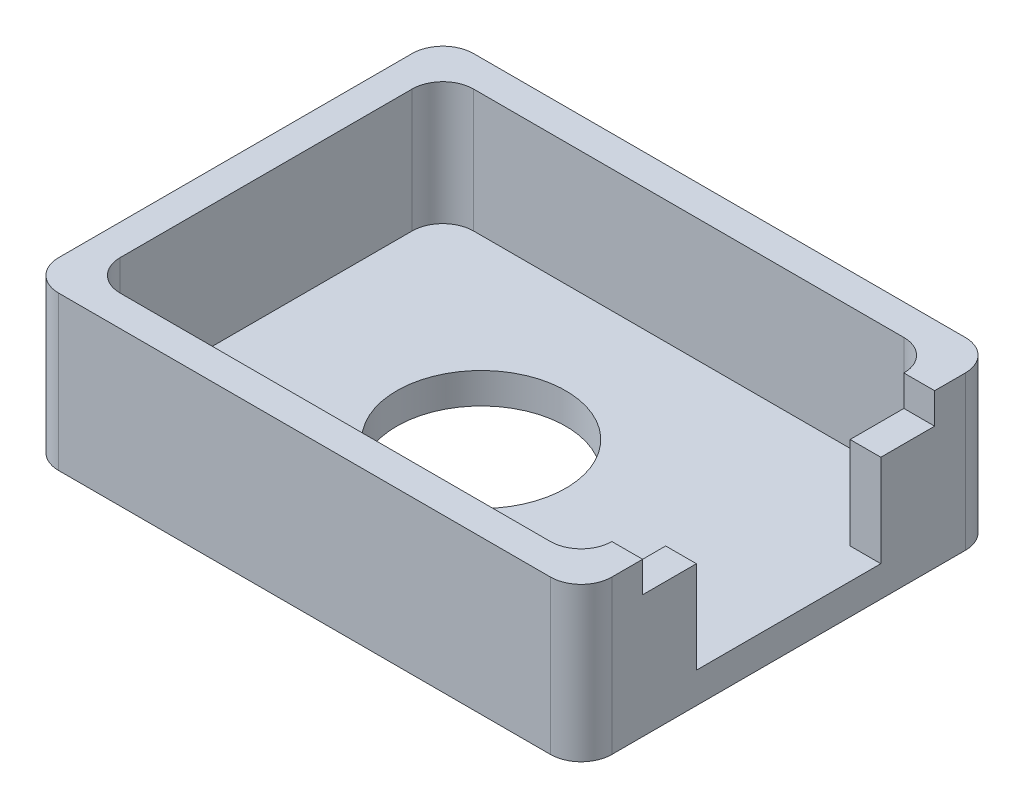
ISO-10303-21;
HEADER;
FILE_DESCRIPTION(('STEP AP214'),'2;1');
FILE_NAME('part.step','',(''),(''),'','','');
FILE_SCHEMA(('AUTOMOTIVE_DESIGN { 1 0 10303 214 1 1 1 1 }'));
ENDSEC;
DATA;
#1=APPLICATION_CONTEXT('core data for automotive mechanical design processes');
#2=APPLICATION_PROTOCOL_DEFINITION('international standard','automotive_design',2000,#1);
#3=PRODUCT_CONTEXT('',#1,'mechanical');
#4=PRODUCT('Part','Part','',(#3));
#5=PRODUCT_RELATED_PRODUCT_CATEGORY('part','',(#4));
#6=PRODUCT_DEFINITION_FORMATION('','',#4);
#7=PRODUCT_DEFINITION_CONTEXT('part definition',#1,'design');
#8=PRODUCT_DEFINITION('design','',#6,#7);
#9=PRODUCT_DEFINITION_SHAPE('','',#8);
#10=(LENGTH_UNIT() NAMED_UNIT(*) SI_UNIT(.MILLI.,.METRE.));
#11=(NAMED_UNIT(*) PLANE_ANGLE_UNIT() SI_UNIT($,.RADIAN.));
#12=(NAMED_UNIT(*) SI_UNIT($,.STERADIAN.) SOLID_ANGLE_UNIT());
#13=UNCERTAINTY_MEASURE_WITH_UNIT(LENGTH_MEASURE(1.E-05),#10,'distance_accuracy_value','');
#14=(GEOMETRIC_REPRESENTATION_CONTEXT(3) GLOBAL_UNCERTAINTY_ASSIGNED_CONTEXT((#13)) GLOBAL_UNIT_ASSIGNED_CONTEXT((#10,
#11,#12)) REPRESENTATION_CONTEXT('',''));
#15=CARTESIAN_POINT('',(0.,0.,0.));
#16=DIRECTION('',(0.,0.,1.));
#17=DIRECTION('',(1.,0.,0.));
#18=AXIS2_PLACEMENT_3D('',#15,#16,#17);
#19=CARTESIAN_POINT('',(0.,2.,0.));
#20=DIRECTION('',(0.,-1.,0.));
#21=DIRECTION('',(0.,0.,-1.));
#22=AXIS2_PLACEMENT_3D('',#19,#20,#21);
#23=PLANE('',#22);
#24=CARTESIAN_POINT('',(-2.00000000000001,2.,0.));
#25=DIRECTION('',(0.,1.,0.));
#26=DIRECTION('',(0.,0.,1.));
#27=AXIS2_PLACEMENT_3D('',#24,#25,#26);
#28=CIRCLE('',#27,5.5);
#29=CARTESIAN_POINT('',(-2.00000000000001,2.,5.5));
#30=VERTEX_POINT('',#29);
#31=EDGE_CURVE('E253',#30,#30,#28,.T.);
#32=ORIENTED_EDGE('',*,*,#31,.F.);
#33=EDGE_LOOP('',(#32));
#34=FACE_BOUND('',#33,.T.);
#35=DIRECTION('',(0.,0.,1.));
#36=VECTOR('',#35,1.);
#37=CARTESIAN_POINT('',(16.,2.,-11.5));
#38=LINE('',#37,#36);
#39=CARTESIAN_POINT('',(16.,2.,-9.49999999999999));
#40=VERTEX_POINT('',#39);
#41=CARTESIAN_POINT('',(16.0000000000001,2.,-5.99999999999999));
#42=VERTEX_POINT('',#41);
#43=EDGE_CURVE('E392',#40,#42,#38,.T.);
#44=ORIENTED_EDGE('',*,*,#43,.F.);
#45=CARTESIAN_POINT('',(14.,2.,-9.49999999999999));
#46=DIRECTION('',(0.,-1.,0.));
#47=DIRECTION('',(0.,0.,-1.));
#48=AXIS2_PLACEMENT_3D('',#45,#46,#47);
#49=CIRCLE('',#48,2.);
#50=CARTESIAN_POINT('',(14.,2.,-11.5));
#51=VERTEX_POINT('',#50);
#52=EDGE_CURVE('E267',#40,#51,#49,.F.);
#53=ORIENTED_EDGE('',*,*,#52,.T.);
#54=DIRECTION('',(1.,0.,0.));
#55=VECTOR('',#54,1.);
#56=CARTESIAN_POINT('',(-16.,2.,-11.5));
#57=LINE('',#56,#55);
#58=CARTESIAN_POINT('',(-14.,2.,-11.5));
#59=VERTEX_POINT('',#58);
#60=EDGE_CURVE('E383',#59,#51,#57,.T.);
#61=ORIENTED_EDGE('',*,*,#60,.F.);
#62=CARTESIAN_POINT('',(-14.,2.,-9.49999999999999));
#63=DIRECTION('',(0.,-1.,0.));
#64=DIRECTION('',(0.,0.,-1.));
#65=AXIS2_PLACEMENT_3D('',#62,#63,#64);
#66=CIRCLE('',#65,2.);
#67=CARTESIAN_POINT('',(-16.,2.,-9.49999999999999));
#68=VERTEX_POINT('',#67);
#69=EDGE_CURVE('E240',#59,#68,#66,.F.);
#70=ORIENTED_EDGE('',*,*,#69,.T.);
#71=DIRECTION('',(0.,0.,-1.));
#72=VECTOR('',#71,1.);
#73=CARTESIAN_POINT('',(-16.,2.,11.5));
#74=LINE('',#73,#72);
#75=CARTESIAN_POINT('',(-16.,2.,9.50000000000001));
#76=VERTEX_POINT('',#75);
#77=EDGE_CURVE('E375',#76,#68,#74,.T.);
#78=ORIENTED_EDGE('',*,*,#77,.F.);
#79=CARTESIAN_POINT('',(-14.,2.,9.50000000000001));
#80=DIRECTION('',(0.,-1.,0.));
#81=DIRECTION('',(0.,0.,-1.));
#82=AXIS2_PLACEMENT_3D('',#79,#80,#81);
#83=CIRCLE('',#82,2.);
#84=CARTESIAN_POINT('',(-14.,2.,11.5));
#85=VERTEX_POINT('',#84);
#86=EDGE_CURVE('E261',#76,#85,#83,.F.);
#87=ORIENTED_EDGE('',*,*,#86,.T.);
#88=DIRECTION('',(-1.,0.,0.));
#89=VECTOR('',#88,1.);
#90=CARTESIAN_POINT('',(16.,2.,11.5));
#91=LINE('',#90,#89);
#92=CARTESIAN_POINT('',(14.,2.,11.5));
#93=VERTEX_POINT('',#92);
#94=EDGE_CURVE('E374',#93,#85,#91,.T.);
#95=ORIENTED_EDGE('',*,*,#94,.F.);
#96=CARTESIAN_POINT('',(14.,2.,9.5));
#97=DIRECTION('',(0.,-1.,0.));
#98=DIRECTION('',(0.,0.,-1.));
#99=AXIS2_PLACEMENT_3D('',#96,#97,#98);
#100=CIRCLE('',#99,2.);
#101=CARTESIAN_POINT('',(16.,2.,9.50000000000001));
#102=VERTEX_POINT('',#101);
#103=EDGE_CURVE('E264',#93,#102,#100,.F.);
#104=ORIENTED_EDGE('',*,*,#103,.T.);
#105=DIRECTION('',(0.,0.,1.));
#106=VECTOR('',#105,1.);
#107=CARTESIAN_POINT('',(16.,2.,9.5));
#108=LINE('',#107,#106);
#109=CARTESIAN_POINT('',(16.,2.,6.));
#110=VERTEX_POINT('',#109);
#111=EDGE_CURVE('E224',#110,#102,#108,.T.);
#112=ORIENTED_EDGE('',*,*,#111,.F.);
#113=DIRECTION('',(1.,0.,0.));
#114=VECTOR('',#113,1.);
#115=CARTESIAN_POINT('',(9.0537780052751,2.,6.));
#116=LINE('',#115,#114);
#117=CARTESIAN_POINT('',(18.,2.,6.));
#118=VERTEX_POINT('',#117);
#119=EDGE_CURVE('E207',#110,#118,#116,.T.);
#120=ORIENTED_EDGE('',*,*,#119,.T.);
#121=DIRECTION('',(0.,0.,-1.));
#122=VECTOR('',#121,1.);
#123=CARTESIAN_POINT('',(18.,2.,13.5));
#124=LINE('',#123,#122);
#125=CARTESIAN_POINT('',(18.,2.,-5.99999999999999));
#126=VERTEX_POINT('',#125);
#127=EDGE_CURVE('E221',#118,#126,#124,.T.);
#128=ORIENTED_EDGE('',*,*,#127,.T.);
#129=DIRECTION('',(1.,0.,0.));
#130=VECTOR('',#129,1.);
#131=CARTESIAN_POINT('',(9.0537780052751,2.00000000000001,-6.));
#132=LINE('',#131,#130);
#133=EDGE_CURVE('E563',#42,#126,#132,.T.);
#134=ORIENTED_EDGE('',*,*,#133,.F.);
#135=EDGE_LOOP('',(#44,#53,#61,#70,#78,#87,#95,#104,#112,#120,#128,#134));
#136=FACE_BOUND('',#135,.T.);
#137=ADVANCED_FACE('F45',(#34,#136),#23,.F.);
#138=CARTESIAN_POINT('',(0.,0.,0.));
#139=DIRECTION('',(0.,-1.,0.));
#140=DIRECTION('',(0.,0.,-1.));
#141=AXIS2_PLACEMENT_3D('',#138,#139,#140);
#142=PLANE('',#141);
#143=DIRECTION('',(1.,0.,0.));
#144=VECTOR('',#143,1.);
#145=CARTESIAN_POINT('',(-18.,0.,13.5));
#146=LINE('',#145,#144);
#147=CARTESIAN_POINT('',(-16.,0.,13.5));
#148=VERTEX_POINT('',#147);
#149=CARTESIAN_POINT('',(16.,0.,13.5));
#150=VERTEX_POINT('',#149);
#151=EDGE_CURVE('E236',#148,#150,#146,.T.);
#152=ORIENTED_EDGE('',*,*,#151,.F.);
#153=CARTESIAN_POINT('',(-16.,0.,11.5));
#154=DIRECTION('',(0.,-1.,0.));
#155=DIRECTION('',(0.,0.,-1.));
#156=AXIS2_PLACEMENT_3D('',#153,#154,#155);
#157=CIRCLE('',#156,2.);
#158=CARTESIAN_POINT('',(-18.,0.,11.5));
#159=VERTEX_POINT('',#158);
#160=EDGE_CURVE('E310',#148,#159,#157,.T.);
#161=ORIENTED_EDGE('',*,*,#160,.T.);
#162=DIRECTION('',(0.,0.,1.));
#163=VECTOR('',#162,1.);
#164=CARTESIAN_POINT('',(-18.,0.,13.5));
#165=LINE('',#164,#163);
#166=CARTESIAN_POINT('',(-18.,0.,-11.5));
#167=VERTEX_POINT('',#166);
#168=EDGE_CURVE('E243',#167,#159,#165,.T.);
#169=ORIENTED_EDGE('',*,*,#168,.F.);
#170=CARTESIAN_POINT('',(-16.,0.,-11.5));
#171=DIRECTION('',(0.,-1.,0.));
#172=DIRECTION('',(0.,0.,-1.));
#173=AXIS2_PLACEMENT_3D('',#170,#171,#172);
#174=CIRCLE('',#173,2.);
#175=CARTESIAN_POINT('',(-16.,0.,-13.5));
#176=VERTEX_POINT('',#175);
#177=EDGE_CURVE('E307',#167,#176,#174,.T.);
#178=ORIENTED_EDGE('',*,*,#177,.T.);
#179=DIRECTION('',(-1.,0.,0.));
#180=VECTOR('',#179,1.);
#181=CARTESIAN_POINT('',(-18.,0.,-13.5));
#182=LINE('',#181,#180);
#183=CARTESIAN_POINT('',(16.,0.,-13.5));
#184=VERTEX_POINT('',#183);
#185=EDGE_CURVE('E252',#184,#176,#182,.T.);
#186=ORIENTED_EDGE('',*,*,#185,.F.);
#187=CARTESIAN_POINT('',(16.,0.,-11.5));
#188=DIRECTION('',(0.,-1.,0.));
#189=DIRECTION('',(0.,0.,-1.));
#190=AXIS2_PLACEMENT_3D('',#187,#188,#189);
#191=CIRCLE('',#190,2.);
#192=CARTESIAN_POINT('',(18.,0.,-11.5));
#193=VERTEX_POINT('',#192);
#194=EDGE_CURVE('E304',#184,#193,#191,.T.);
#195=ORIENTED_EDGE('',*,*,#194,.T.);
#196=DIRECTION('',(0.,0.,-1.));
#197=VECTOR('',#196,1.);
#198=CARTESIAN_POINT('',(18.,0.,13.5));
#199=LINE('',#198,#197);
#200=CARTESIAN_POINT('',(18.,0.,11.5));
#201=VERTEX_POINT('',#200);
#202=EDGE_CURVE('E249',#201,#193,#199,.T.);
#203=ORIENTED_EDGE('',*,*,#202,.F.);
#204=CARTESIAN_POINT('',(16.,0.,11.5));
#205=DIRECTION('',(0.,-1.,0.));
#206=DIRECTION('',(0.,0.,-1.));
#207=AXIS2_PLACEMENT_3D('',#204,#205,#206);
#208=CIRCLE('',#207,2.);
#209=EDGE_CURVE('E301',#201,#150,#208,.T.);
#210=ORIENTED_EDGE('',*,*,#209,.T.);
#211=EDGE_LOOP('',(#152,#161,#169,#178,#186,#195,#203,#210));
#212=FACE_BOUND('',#211,.T.);
#213=CARTESIAN_POINT('',(-2.00000000000001,0.,0.));
#214=DIRECTION('',(0.,1.,0.));
#215=DIRECTION('',(0.,0.,1.));
#216=AXIS2_PLACEMENT_3D('',#213,#214,#215);
#217=CIRCLE('',#216,5.5);
#218=CARTESIAN_POINT('',(-2.00000000000001,0.,5.5));
#219=VERTEX_POINT('',#218);
#220=EDGE_CURVE('E247',#219,#219,#217,.T.);
#221=ORIENTED_EDGE('',*,*,#220,.T.);
#222=EDGE_LOOP('',(#221));
#223=FACE_BOUND('',#222,.T.);
#224=ADVANCED_FACE('F420',(#212,#223),#142,.T.);
#225=CARTESIAN_POINT('',(18.,2.,13.5));
#226=DIRECTION('',(-1.,0.,0.));
#227=DIRECTION('',(0.,0.,1.));
#228=AXIS2_PLACEMENT_3D('',#225,#226,#227);
#229=PLANE('',#228);
#230=ORIENTED_EDGE('',*,*,#202,.T.);
#231=DIRECTION('',(0.,-1.,0.));
#232=VECTOR('',#231,1.);
#233=CARTESIAN_POINT('',(18.,2.,-11.5));
#234=LINE('',#233,#232);
#235=CARTESIAN_POINT('',(18.,10.,-11.5));
#236=VERTEX_POINT('',#235);
#237=EDGE_CURVE('E341',#193,#236,#234,.F.);
#238=ORIENTED_EDGE('',*,*,#237,.T.);
#239=DIRECTION('',(0.,0.,-1.));
#240=VECTOR('',#239,1.);
#241=CARTESIAN_POINT('',(18.,10.,-9.49999999999999));
#242=LINE('',#241,#240);
#243=CARTESIAN_POINT('',(18.,10.,-9.49999999999999));
#244=VERTEX_POINT('',#243);
#245=EDGE_CURVE('E395',#244,#236,#242,.T.);
#246=ORIENTED_EDGE('',*,*,#245,.F.);
#247=DIRECTION('',(0.,-1.,0.));
#248=VECTOR('',#247,1.);
#249=CARTESIAN_POINT('',(18.,10.,-9.49999999999999));
#250=LINE('',#249,#248);
#251=CARTESIAN_POINT('',(18.,8.00000000000001,-9.49999999999999));
#252=VERTEX_POINT('',#251);
#253=EDGE_CURVE('E396',#244,#252,#250,.T.);
#254=ORIENTED_EDGE('',*,*,#253,.T.);
#255=DIRECTION('',(0.,0.,1.));
#256=VECTOR('',#255,1.);
#257=CARTESIAN_POINT('',(18.,8.00000000000001,-9.49999999999999));
#258=LINE('',#257,#256);
#259=CARTESIAN_POINT('',(18.,8.00000000000001,-5.99999999999999));
#260=VERTEX_POINT('',#259);
#261=EDGE_CURVE('E216',#252,#260,#258,.T.);
#262=ORIENTED_EDGE('',*,*,#261,.T.);
#263=DIRECTION('',(0.,-1.,0.));
#264=VECTOR('',#263,1.);
#265=CARTESIAN_POINT('',(18.,8.00000000000001,-5.99999999999999));
#266=LINE('',#265,#264);
#267=EDGE_CURVE('E233',#260,#126,#266,.T.);
#268=ORIENTED_EDGE('',*,*,#267,.T.);
#269=ORIENTED_EDGE('',*,*,#127,.F.);
#270=DIRECTION('',(0.,1.,0.));
#271=VECTOR('',#270,1.);
#272=CARTESIAN_POINT('',(18.,8.,6.));
#273=LINE('',#272,#271);
#274=CARTESIAN_POINT('',(18.,8.,6.));
#275=VERTEX_POINT('',#274);
#276=EDGE_CURVE('E203',#118,#275,#273,.T.);
#277=ORIENTED_EDGE('',*,*,#276,.T.);
#278=DIRECTION('',(0.,0.,1.));
#279=VECTOR('',#278,1.);
#280=CARTESIAN_POINT('',(18.,8.,9.5));
#281=LINE('',#280,#279);
#282=CARTESIAN_POINT('',(18.,8.,9.5));
#283=VERTEX_POINT('',#282);
#284=EDGE_CURVE('E215',#275,#283,#281,.T.);
#285=ORIENTED_EDGE('',*,*,#284,.T.);
#286=DIRECTION('',(0.,-1.,0.));
#287=VECTOR('',#286,1.);
#288=CARTESIAN_POINT('',(18.,10.,9.5));
#289=LINE('',#288,#287);
#290=CARTESIAN_POINT('',(18.,10.,9.5));
#291=VERTEX_POINT('',#290);
#292=EDGE_CURVE('E409',#291,#283,#289,.T.);
#293=ORIENTED_EDGE('',*,*,#292,.F.);
#294=DIRECTION('',(0.,0.,-1.));
#295=VECTOR('',#294,1.);
#296=CARTESIAN_POINT('',(18.,10.,13.5));
#297=LINE('',#296,#295);
#298=CARTESIAN_POINT('',(18.,10.,11.5));
#299=VERTEX_POINT('',#298);
#300=EDGE_CURVE('E504',#299,#291,#297,.T.);
#301=ORIENTED_EDGE('',*,*,#300,.F.);
#302=DIRECTION('',(0.,-1.,0.));
#303=VECTOR('',#302,1.);
#304=CARTESIAN_POINT('',(18.,2.,11.5));
#305=LINE('',#304,#303);
#306=EDGE_CURVE('E337',#299,#201,#305,.T.);
#307=ORIENTED_EDGE('',*,*,#306,.T.);
#308=EDGE_LOOP('',(#230,#238,#246,#254,#262,#268,#269,#277,#285,#293,#301,#307));
#309=FACE_BOUND('',#308,.T.);
#310=ADVANCED_FACE('F230',(#309),#229,.F.);
#311=CARTESIAN_POINT('',(-18.,2.,-13.5));
#312=DIRECTION('',(0.,0.,1.));
#313=DIRECTION('',(1.,0.,0.));
#314=AXIS2_PLACEMENT_3D('',#311,#312,#313);
#315=PLANE('',#314);
#316=ORIENTED_EDGE('',*,*,#185,.T.);
#317=DIRECTION('',(0.,-1.,0.));
#318=VECTOR('',#317,1.);
#319=CARTESIAN_POINT('',(-16.,2.,-13.5));
#320=LINE('',#319,#318);
#321=CARTESIAN_POINT('',(-16.,10.,-13.5));
#322=VERTEX_POINT('',#321);
#323=EDGE_CURVE('E69',#176,#322,#320,.F.);
#324=ORIENTED_EDGE('',*,*,#323,.T.);
#325=DIRECTION('',(-1.,0.,0.));
#326=VECTOR('',#325,1.);
#327=CARTESIAN_POINT('',(18.,10.,-13.5));
#328=LINE('',#327,#326);
#329=CARTESIAN_POINT('',(16.,10.,-13.5));
#330=VERTEX_POINT('',#329);
#331=EDGE_CURVE('E488',#330,#322,#328,.T.);
#332=ORIENTED_EDGE('',*,*,#331,.F.);
#333=DIRECTION('',(0.,-1.,0.));
#334=VECTOR('',#333,1.);
#335=CARTESIAN_POINT('',(16.,2.,-13.5));
#336=LINE('',#335,#334);
#337=EDGE_CURVE('E331',#330,#184,#336,.T.);
#338=ORIENTED_EDGE('',*,*,#337,.T.);
#339=EDGE_LOOP('',(#316,#324,#332,#338));
#340=FACE_BOUND('',#339,.T.);
#341=ADVANCED_FACE('F450',(#340),#315,.F.);
#342=CARTESIAN_POINT('',(-18.,2.,13.5));
#343=DIRECTION('',(1.,0.,0.));
#344=DIRECTION('',(0.,0.,-1.));
#345=AXIS2_PLACEMENT_3D('',#342,#343,#344);
#346=PLANE('',#345);
#347=ORIENTED_EDGE('',*,*,#168,.T.);
#348=DIRECTION('',(0.,-1.,0.));
#349=VECTOR('',#348,1.);
#350=CARTESIAN_POINT('',(-18.,2.,11.5));
#351=LINE('',#350,#349);
#352=CARTESIAN_POINT('',(-18.,10.,11.5));
#353=VERTEX_POINT('',#352);
#354=EDGE_CURVE('E317',#159,#353,#351,.F.);
#355=ORIENTED_EDGE('',*,*,#354,.T.);
#356=DIRECTION('',(0.,0.,1.));
#357=VECTOR('',#356,1.);
#358=CARTESIAN_POINT('',(-18.,10.,-13.5));
#359=LINE('',#358,#357);
#360=CARTESIAN_POINT('',(-18.,10.,-11.5));
#361=VERTEX_POINT('',#360);
#362=EDGE_CURVE('E493',#361,#353,#359,.T.);
#363=ORIENTED_EDGE('',*,*,#362,.F.);
#364=DIRECTION('',(0.,-1.,0.));
#365=VECTOR('',#364,1.);
#366=CARTESIAN_POINT('',(-18.,2.,-11.5));
#367=LINE('',#366,#365);
#368=EDGE_CURVE('E313',#361,#167,#367,.T.);
#369=ORIENTED_EDGE('',*,*,#368,.T.);
#370=EDGE_LOOP('',(#347,#355,#363,#369));
#371=FACE_BOUND('',#370,.T.);
#372=ADVANCED_FACE('F435',(#371),#346,.F.);
#373=CARTESIAN_POINT('',(-18.,2.,13.5));
#374=DIRECTION('',(0.,0.,-1.));
#375=DIRECTION('',(-1.,0.,0.));
#376=AXIS2_PLACEMENT_3D('',#373,#374,#375);
#377=PLANE('',#376);
#378=DIRECTION('',(1.,0.,0.));
#379=VECTOR('',#378,1.);
#380=CARTESIAN_POINT('',(-18.,10.,13.5));
#381=LINE('',#380,#379);
#382=CARTESIAN_POINT('',(-16.,10.,13.5));
#383=VERTEX_POINT('',#382);
#384=CARTESIAN_POINT('',(16.,10.,13.5));
#385=VERTEX_POINT('',#384);
#386=EDGE_CURVE('E497',#383,#385,#381,.T.);
#387=ORIENTED_EDGE('',*,*,#386,.F.);
#388=DIRECTION('',(0.,-1.,0.));
#389=VECTOR('',#388,1.);
#390=CARTESIAN_POINT('',(-16.,2.,13.5));
#391=LINE('',#390,#389);
#392=EDGE_CURVE('E297',#383,#148,#391,.T.);
#393=ORIENTED_EDGE('',*,*,#392,.T.);
#394=ORIENTED_EDGE('',*,*,#151,.T.);
#395=DIRECTION('',(0.,-1.,0.));
#396=VECTOR('',#395,1.);
#397=CARTESIAN_POINT('',(16.,2.,13.5));
#398=LINE('',#397,#396);
#399=EDGE_CURVE('E294',#150,#385,#398,.F.);
#400=ORIENTED_EDGE('',*,*,#399,.T.);
#401=EDGE_LOOP('',(#387,#393,#394,#400));
#402=FACE_BOUND('',#401,.T.);
#403=ADVANCED_FACE('F425',(#402),#377,.F.);
#404=CARTESIAN_POINT('',(-2.00000000000001,2.,0.));
#405=DIRECTION('',(0.,-1.,0.));
#406=DIRECTION('',(0.,0.,-1.));
#407=AXIS2_PLACEMENT_3D('',#404,#405,#406);
#408=CYLINDRICAL_SURFACE('',#407,5.5);
#409=ORIENTED_EDGE('',*,*,#31,.T.);
#410=EDGE_LOOP('',(#409));
#411=FACE_BOUND('',#410,.T.);
#412=ORIENTED_EDGE('',*,*,#220,.F.);
#413=EDGE_LOOP('',(#412));
#414=FACE_BOUND('',#413,.T.);
#415=ADVANCED_FACE('F422',(#411,#414),#408,.F.);
#416=CARTESIAN_POINT('',(18.,10.,9.5));
#417=DIRECTION('',(0.,0.,1.));
#418=DIRECTION('',(1.,0.,0.));
#419=AXIS2_PLACEMENT_3D('',#416,#417,#418);
#420=PLANE('',#419);
#421=ORIENTED_EDGE('',*,*,#292,.T.);
#422=DIRECTION('',(1.,0.,0.));
#423=VECTOR('',#422,1.);
#424=CARTESIAN_POINT('',(9.0537780052751,8.,9.5));
#425=LINE('',#424,#423);
#426=CARTESIAN_POINT('',(16.,8.,9.5));
#427=VERTEX_POINT('',#426);
#428=EDGE_CURVE('E540',#427,#283,#425,.T.);
#429=ORIENTED_EDGE('',*,*,#428,.F.);
#430=DIRECTION('',(0.,-1.,0.));
#431=VECTOR('',#430,1.);
#432=CARTESIAN_POINT('',(16.,10.,9.5));
#433=LINE('',#432,#431);
#434=CARTESIAN_POINT('',(16.,10.,9.5));
#435=VERTEX_POINT('',#434);
#436=EDGE_CURVE('E405',#435,#427,#433,.T.);
#437=ORIENTED_EDGE('',*,*,#436,.F.);
#438=DIRECTION('',(-1.,0.,0.));
#439=VECTOR('',#438,1.);
#440=CARTESIAN_POINT('',(18.,10.,9.5));
#441=LINE('',#440,#439);
#442=EDGE_CURVE('E507',#291,#435,#441,.T.);
#443=ORIENTED_EDGE('',*,*,#442,.F.);
#444=EDGE_LOOP('',(#421,#429,#437,#443));
#445=FACE_BOUND('',#444,.T.);
#446=ADVANCED_FACE('F424',(#445),#420,.F.);
#447=CARTESIAN_POINT('',(16.,10.,9.5));
#448=DIRECTION('',(1.,0.,0.));
#449=DIRECTION('',(0.,0.,-1.));
#450=AXIS2_PLACEMENT_3D('',#447,#448,#449);
#451=PLANE('',#450);
#452=ORIENTED_EDGE('',*,*,#111,.T.);
#453=DIRECTION('',(0.,-1.,0.));
#454=VECTOR('',#453,1.);
#455=CARTESIAN_POINT('',(16.,10.,9.50000000000001));
#456=LINE('',#455,#454);
#457=EDGE_CURVE('E284',#102,#427,#456,.F.);
#458=ORIENTED_EDGE('',*,*,#457,.T.);
#459=DIRECTION('',(0.,0.,-1.));
#460=VECTOR('',#459,1.);
#461=CARTESIAN_POINT('',(16.,8.,9.50000000000002));
#462=LINE('',#461,#460);
#463=CARTESIAN_POINT('',(16.,8.,6.));
#464=VERTEX_POINT('',#463);
#465=EDGE_CURVE('E385',#427,#464,#462,.T.);
#466=ORIENTED_EDGE('',*,*,#465,.T.);
#467=DIRECTION('',(0.,-1.,0.));
#468=VECTOR('',#467,1.);
#469=CARTESIAN_POINT('',(16.,8.,6.));
#470=LINE('',#469,#468);
#471=EDGE_CURVE('E544',#464,#110,#470,.T.);
#472=ORIENTED_EDGE('',*,*,#471,.T.);
#473=EDGE_LOOP('',(#452,#458,#466,#472));
#474=FACE_BOUND('',#473,.T.);
#475=ADVANCED_FACE('F431',(#474),#451,.F.);
#476=CARTESIAN_POINT('',(16.,10.,11.5));
#477=DIRECTION('',(0.,0.,1.));
#478=DIRECTION('',(1.,0.,0.));
#479=AXIS2_PLACEMENT_3D('',#476,#477,#478);
#480=PLANE('',#479);
#481=DIRECTION('',(-1.,0.,0.));
#482=VECTOR('',#481,1.);
#483=CARTESIAN_POINT('',(16.,10.,11.5));
#484=LINE('',#483,#482);
#485=CARTESIAN_POINT('',(14.,10.,11.5));
#486=VERTEX_POINT('',#485);
#487=CARTESIAN_POINT('',(-14.,10.,11.5));
#488=VERTEX_POINT('',#487);
#489=EDGE_CURVE('E359',#486,#488,#484,.T.);
#490=ORIENTED_EDGE('',*,*,#489,.F.);
#491=DIRECTION('',(0.,-1.,0.));
#492=VECTOR('',#491,1.);
#493=CARTESIAN_POINT('',(14.,2.,11.5));
#494=LINE('',#493,#492);
#495=EDGE_CURVE('E280',#486,#93,#494,.T.);
#496=ORIENTED_EDGE('',*,*,#495,.T.);
#497=ORIENTED_EDGE('',*,*,#94,.T.);
#498=DIRECTION('',(0.,-1.,0.));
#499=VECTOR('',#498,1.);
#500=CARTESIAN_POINT('',(-14.,10.,11.5));
#501=LINE('',#500,#499);
#502=EDGE_CURVE('E277',#85,#488,#501,.F.);
#503=ORIENTED_EDGE('',*,*,#502,.T.);
#504=EDGE_LOOP('',(#490,#496,#497,#503));
#505=FACE_BOUND('',#504,.T.);
#506=ADVANCED_FACE('F377',(#505),#480,.F.);
#507=CARTESIAN_POINT('',(-16.,10.,11.5));
#508=DIRECTION('',(-1.,0.,0.));
#509=DIRECTION('',(0.,0.,1.));
#510=AXIS2_PLACEMENT_3D('',#507,#508,#509);
#511=PLANE('',#510);
#512=DIRECTION('',(0.,0.,-1.));
#513=VECTOR('',#512,1.);
#514=CARTESIAN_POINT('',(-16.,10.,11.5));
#515=LINE('',#514,#513);
#516=CARTESIAN_POINT('',(-16.,10.,9.50000000000001));
#517=VERTEX_POINT('',#516);
#518=CARTESIAN_POINT('',(-16.,10.,-9.49999999999999));
#519=VERTEX_POINT('',#518);
#520=EDGE_CURVE('E356',#517,#519,#515,.T.);
#521=ORIENTED_EDGE('',*,*,#520,.F.);
#522=DIRECTION('',(0.,-1.,0.));
#523=VECTOR('',#522,1.);
#524=CARTESIAN_POINT('',(-16.,2.,9.50000000000001));
#525=LINE('',#524,#523);
#526=EDGE_CURVE('E290',#517,#76,#525,.T.);
#527=ORIENTED_EDGE('',*,*,#526,.T.);
#528=ORIENTED_EDGE('',*,*,#77,.T.);
#529=DIRECTION('',(0.,-1.,0.));
#530=VECTOR('',#529,1.);
#531=CARTESIAN_POINT('',(-16.,10.,-9.49999999999999));
#532=LINE('',#531,#530);
#533=EDGE_CURVE('E287',#68,#519,#532,.F.);
#534=ORIENTED_EDGE('',*,*,#533,.T.);
#535=EDGE_LOOP('',(#521,#527,#528,#534));
#536=FACE_BOUND('',#535,.T.);
#537=ADVANCED_FACE('F364',(#536),#511,.F.);
#538=CARTESIAN_POINT('',(-16.,10.,-11.5));
#539=DIRECTION('',(0.,0.,-1.));
#540=DIRECTION('',(-1.,0.,0.));
#541=AXIS2_PLACEMENT_3D('',#538,#539,#540);
#542=PLANE('',#541);
#543=ORIENTED_EDGE('',*,*,#60,.T.);
#544=DIRECTION('',(0.,-1.,0.));
#545=VECTOR('',#544,1.);
#546=CARTESIAN_POINT('',(14.,10.,-11.5));
#547=LINE('',#546,#545);
#548=CARTESIAN_POINT('',(14.,10.,-11.5));
#549=VERTEX_POINT('',#548);
#550=EDGE_CURVE('E274',#51,#549,#547,.F.);
#551=ORIENTED_EDGE('',*,*,#550,.T.);
#552=DIRECTION('',(1.,0.,0.));
#553=VECTOR('',#552,1.);
#554=CARTESIAN_POINT('',(-16.,10.,-11.5));
#555=LINE('',#554,#553);
#556=CARTESIAN_POINT('',(-14.,10.,-11.5));
#557=VERTEX_POINT('',#556);
#558=EDGE_CURVE('E369',#557,#549,#555,.T.);
#559=ORIENTED_EDGE('',*,*,#558,.F.);
#560=DIRECTION('',(0.,-1.,0.));
#561=VECTOR('',#560,1.);
#562=CARTESIAN_POINT('',(-14.,2.,-11.5));
#563=LINE('',#562,#561);
#564=EDGE_CURVE('E270',#557,#59,#563,.T.);
#565=ORIENTED_EDGE('',*,*,#564,.T.);
#566=EDGE_LOOP('',(#543,#551,#559,#565));
#567=FACE_BOUND('',#566,.T.);
#568=ADVANCED_FACE('F587',(#567),#542,.F.);
#569=CARTESIAN_POINT('',(16.,10.,-11.5));
#570=DIRECTION('',(1.,0.,0.));
#571=DIRECTION('',(0.,0.,-1.));
#572=AXIS2_PLACEMENT_3D('',#569,#570,#571);
#573=PLANE('',#572);
#574=DIRECTION('',(0.,0.,-1.));
#575=VECTOR('',#574,1.);
#576=CARTESIAN_POINT('',(16.0000000000001,8.00000000000001,-9.49999999999997));
#577=LINE('',#576,#575);
#578=CARTESIAN_POINT('',(16.,8.00000000000001,-5.99999999999999));
#579=VERTEX_POINT('',#578);
#580=CARTESIAN_POINT('',(16.,8.00000000000001,-9.49999999999999));
#581=VERTEX_POINT('',#580);
#582=EDGE_CURVE('E559',#579,#581,#577,.T.);
#583=ORIENTED_EDGE('',*,*,#582,.T.);
#584=DIRECTION('',(0.,-1.,0.));
#585=VECTOR('',#584,1.);
#586=CARTESIAN_POINT('',(16.,2.,-9.49999999999999));
#587=LINE('',#586,#585);
#588=EDGE_CURVE('E235',#581,#40,#587,.T.);
#589=ORIENTED_EDGE('',*,*,#588,.T.);
#590=ORIENTED_EDGE('',*,*,#43,.T.);
#591=DIRECTION('',(0.,1.,0.));
#592=VECTOR('',#591,1.);
#593=CARTESIAN_POINT('',(16.,8.00000000000001,-5.99999999999999));
#594=LINE('',#593,#592);
#595=EDGE_CURVE('E556',#42,#579,#594,.T.);
#596=ORIENTED_EDGE('',*,*,#595,.T.);
#597=EDGE_LOOP('',(#583,#589,#590,#596));
#598=FACE_BOUND('',#597,.T.);
#599=ADVANCED_FACE('F575',(#598),#573,.F.);
#600=CARTESIAN_POINT('',(16.,10.,-9.49999999999999));
#601=DIRECTION('',(0.,0.,-1.));
#602=DIRECTION('',(-1.,0.,0.));
#603=AXIS2_PLACEMENT_3D('',#600,#601,#602);
#604=PLANE('',#603);
#605=DIRECTION('',(0.,-1.,0.));
#606=VECTOR('',#605,1.);
#607=CARTESIAN_POINT('',(16.,10.,-9.49999999999999));
#608=LINE('',#607,#606);
#609=CARTESIAN_POINT('',(16.,10.,-9.49999999999999));
#610=VERTEX_POINT('',#609);
#611=EDGE_CURVE('E400',#610,#581,#608,.T.);
#612=ORIENTED_EDGE('',*,*,#611,.T.);
#613=DIRECTION('',(1.,0.,0.));
#614=VECTOR('',#613,1.);
#615=CARTESIAN_POINT('',(9.0537780052751,8.00000000000001,-9.49999999999999));
#616=LINE('',#615,#614);
#617=EDGE_CURVE('E522',#581,#252,#616,.T.);
#618=ORIENTED_EDGE('',*,*,#617,.T.);
#619=ORIENTED_EDGE('',*,*,#253,.F.);
#620=DIRECTION('',(1.,0.,0.));
#621=VECTOR('',#620,1.);
#622=CARTESIAN_POINT('',(16.,10.,-9.49999999999999));
#623=LINE('',#622,#621);
#624=EDGE_CURVE('E401',#610,#244,#623,.T.);
#625=ORIENTED_EDGE('',*,*,#624,.F.);
#626=EDGE_LOOP('',(#612,#618,#619,#625));
#627=FACE_BOUND('',#626,.T.);
#628=ADVANCED_FACE('F520',(#627),#604,.F.);
#629=CARTESIAN_POINT('',(0.,10.,0.));
#630=DIRECTION('',(0.,1.,0.));
#631=DIRECTION('',(0.,0.,1.));
#632=AXIS2_PLACEMENT_3D('',#629,#630,#631);
#633=PLANE('',#632);
#634=ORIENTED_EDGE('',*,*,#362,.T.);
#635=CARTESIAN_POINT('',(-16.,10.,11.5));
#636=DIRECTION('',(0.,1.,0.));
#637=DIRECTION('',(0.,0.,1.));
#638=AXIS2_PLACEMENT_3D('',#635,#636,#637);
#639=CIRCLE('',#638,2.);
#640=EDGE_CURVE('E328',#353,#383,#639,.T.);
#641=ORIENTED_EDGE('',*,*,#640,.T.);
#642=ORIENTED_EDGE('',*,*,#386,.T.);
#643=CARTESIAN_POINT('',(16.,10.,11.5));
#644=DIRECTION('',(0.,1.,0.));
#645=DIRECTION('',(0.,0.,1.));
#646=AXIS2_PLACEMENT_3D('',#643,#644,#645);
#647=CIRCLE('',#646,2.);
#648=EDGE_CURVE('E61',#385,#299,#647,.T.);
#649=ORIENTED_EDGE('',*,*,#648,.T.);
#650=ORIENTED_EDGE('',*,*,#300,.T.);
#651=ORIENTED_EDGE('',*,*,#442,.T.);
#652=CARTESIAN_POINT('',(14.,10.,9.5));
#653=DIRECTION('',(0.,1.,0.));
#654=DIRECTION('',(0.,0.,1.));
#655=AXIS2_PLACEMENT_3D('',#652,#653,#654);
#656=CIRCLE('',#655,2.);
#657=EDGE_CURVE('E347',#435,#486,#656,.F.);
#658=ORIENTED_EDGE('',*,*,#657,.T.);
#659=ORIENTED_EDGE('',*,*,#489,.T.);
#660=CARTESIAN_POINT('',(-14.,10.,9.50000000000001));
#661=DIRECTION('',(0.,1.,0.));
#662=DIRECTION('',(0.,0.,1.));
#663=AXIS2_PLACEMENT_3D('',#660,#661,#662);
#664=CIRCLE('',#663,2.);
#665=EDGE_CURVE('E54',#488,#517,#664,.F.);
#666=ORIENTED_EDGE('',*,*,#665,.T.);
#667=ORIENTED_EDGE('',*,*,#520,.T.);
#668=CARTESIAN_POINT('',(-14.,10.,-9.49999999999999));
#669=DIRECTION('',(0.,1.,0.));
#670=DIRECTION('',(0.,0.,1.));
#671=AXIS2_PLACEMENT_3D('',#668,#669,#670);
#672=CIRCLE('',#671,2.);
#673=EDGE_CURVE('E11',#519,#557,#672,.F.);
#674=ORIENTED_EDGE('',*,*,#673,.T.);
#675=ORIENTED_EDGE('',*,*,#558,.T.);
#676=CARTESIAN_POINT('',(14.,10.,-9.49999999999999));
#677=DIRECTION('',(0.,1.,0.));
#678=DIRECTION('',(0.,0.,1.));
#679=AXIS2_PLACEMENT_3D('',#676,#677,#678);
#680=CIRCLE('',#679,2.);
#681=EDGE_CURVE('E344',#549,#610,#680,.F.);
#682=ORIENTED_EDGE('',*,*,#681,.T.);
#683=ORIENTED_EDGE('',*,*,#624,.T.);
#684=ORIENTED_EDGE('',*,*,#245,.T.);
#685=CARTESIAN_POINT('',(16.,10.,-11.5));
#686=DIRECTION('',(0.,1.,0.));
#687=DIRECTION('',(0.,0.,1.));
#688=AXIS2_PLACEMENT_3D('',#685,#686,#687);
#689=CIRCLE('',#688,2.);
#690=EDGE_CURVE('E322',#236,#330,#689,.T.);
#691=ORIENTED_EDGE('',*,*,#690,.T.);
#692=ORIENTED_EDGE('',*,*,#331,.T.);
#693=CARTESIAN_POINT('',(-16.,10.,-11.5));
#694=DIRECTION('',(0.,1.,0.));
#695=DIRECTION('',(0.,0.,1.));
#696=AXIS2_PLACEMENT_3D('',#693,#694,#695);
#697=CIRCLE('',#696,2.);
#698=EDGE_CURVE('E325',#322,#361,#697,.T.);
#699=ORIENTED_EDGE('',*,*,#698,.T.);
#700=EDGE_LOOP('',(#634,#641,#642,#649,#650,#651,#658,#659,#666,#667,#674,#675,#682,#683,#684,
#691,#692,#699));
#701=FACE_BOUND('',#700,.T.);
#702=ADVANCED_FACE('F355',(#701),#633,.T.);
#703=CARTESIAN_POINT('',(9.0537780052751,8.00000000000001,-9.49999999999999));
#704=DIRECTION('',(0.,1.,0.));
#705=DIRECTION('',(0.,0.,1.));
#706=AXIS2_PLACEMENT_3D('',#703,#704,#705);
#707=PLANE('',#706);
#708=ORIENTED_EDGE('',*,*,#582,.F.);
#709=DIRECTION('',(1.,0.,0.));
#710=VECTOR('',#709,1.);
#711=CARTESIAN_POINT('',(9.0537780052751,8.00000000000001,-5.99999999999999));
#712=LINE('',#711,#710);
#713=EDGE_CURVE('E560',#579,#260,#712,.T.);
#714=ORIENTED_EDGE('',*,*,#713,.T.);
#715=ORIENTED_EDGE('',*,*,#261,.F.);
#716=ORIENTED_EDGE('',*,*,#617,.F.);
#717=EDGE_LOOP('',(#708,#714,#715,#716));
#718=FACE_BOUND('',#717,.T.);
#719=ADVANCED_FACE('F579',(#718),#707,.T.);
#720=CARTESIAN_POINT('',(9.0537780052751,8.00000000000001,-5.99999999999999));
#721=DIRECTION('',(0.,0.,1.));
#722=DIRECTION('',(0.,-1.,0.));
#723=AXIS2_PLACEMENT_3D('',#720,#721,#722);
#724=PLANE('',#723);
#725=ORIENTED_EDGE('',*,*,#595,.F.);
#726=ORIENTED_EDGE('',*,*,#133,.T.);
#727=ORIENTED_EDGE('',*,*,#267,.F.);
#728=ORIENTED_EDGE('',*,*,#713,.F.);
#729=EDGE_LOOP('',(#725,#726,#727,#728));
#730=FACE_BOUND('',#729,.T.);
#731=ADVANCED_FACE('F581',(#730),#724,.T.);
#732=CARTESIAN_POINT('',(9.0537780052751,8.,9.5));
#733=DIRECTION('',(0.,1.,0.));
#734=DIRECTION('',(0.,0.,1.));
#735=AXIS2_PLACEMENT_3D('',#732,#733,#734);
#736=PLANE('',#735);
#737=ORIENTED_EDGE('',*,*,#465,.F.);
#738=ORIENTED_EDGE('',*,*,#428,.T.);
#739=ORIENTED_EDGE('',*,*,#284,.F.);
#740=DIRECTION('',(1.,0.,0.));
#741=VECTOR('',#740,1.);
#742=CARTESIAN_POINT('',(9.0537780052751,8.,6.));
#743=LINE('',#742,#741);
#744=EDGE_CURVE('E209',#464,#275,#743,.T.);
#745=ORIENTED_EDGE('',*,*,#744,.F.);
#746=EDGE_LOOP('',(#737,#738,#739,#745));
#747=FACE_BOUND('',#746,.T.);
#748=ADVANCED_FACE('F724',(#747),#736,.T.);
#749=CARTESIAN_POINT('',(9.0537780052751,8.,6.));
#750=DIRECTION('',(0.,0.,-1.));
#751=DIRECTION('',(-1.,0.,0.));
#752=AXIS2_PLACEMENT_3D('',#749,#750,#751);
#753=PLANE('',#752);
#754=ORIENTED_EDGE('',*,*,#471,.F.);
#755=ORIENTED_EDGE('',*,*,#744,.T.);
#756=ORIENTED_EDGE('',*,*,#276,.F.);
#757=ORIENTED_EDGE('',*,*,#119,.F.);
#758=EDGE_LOOP('',(#754,#755,#756,#757));
#759=FACE_BOUND('',#758,.T.);
#760=ADVANCED_FACE('F206',(#759),#753,.T.);
#761=CARTESIAN_POINT('',(14.,10.,-9.49999999999999));
#762=DIRECTION('',(0.,1.,0.));
#763=DIRECTION('',(0.,0.,1.));
#764=AXIS2_PLACEMENT_3D('',#761,#762,#763);
#765=CYLINDRICAL_SURFACE('',#764,2.);
#766=ORIENTED_EDGE('',*,*,#681,.F.);
#767=ORIENTED_EDGE('',*,*,#550,.F.);
#768=ORIENTED_EDGE('',*,*,#52,.F.);
#769=ORIENTED_EDGE('',*,*,#588,.F.);
#770=ORIENTED_EDGE('',*,*,#611,.F.);
#771=EDGE_LOOP('',(#766,#767,#768,#769,#770));
#772=FACE_BOUND('',#771,.T.);
#773=ADVANCED_FACE('F456',(#772),#765,.F.);
#774=CARTESIAN_POINT('',(14.,10.,9.5));
#775=DIRECTION('',(0.,1.,0.));
#776=DIRECTION('',(0.,0.,1.));
#777=AXIS2_PLACEMENT_3D('',#774,#775,#776);
#778=CYLINDRICAL_SURFACE('',#777,2.);
#779=ORIENTED_EDGE('',*,*,#436,.T.);
#780=ORIENTED_EDGE('',*,*,#457,.F.);
#781=ORIENTED_EDGE('',*,*,#103,.F.);
#782=ORIENTED_EDGE('',*,*,#495,.F.);
#783=ORIENTED_EDGE('',*,*,#657,.F.);
#784=EDGE_LOOP('',(#779,#780,#781,#782,#783));
#785=FACE_BOUND('',#784,.T.);
#786=ADVANCED_FACE('F459',(#785),#778,.F.);
#787=CARTESIAN_POINT('',(-14.,10.,9.50000000000001));
#788=DIRECTION('',(0.,1.,0.));
#789=DIRECTION('',(0.,0.,1.));
#790=AXIS2_PLACEMENT_3D('',#787,#788,#789);
#791=CYLINDRICAL_SURFACE('',#790,2.);
#792=ORIENTED_EDGE('',*,*,#665,.F.);
#793=ORIENTED_EDGE('',*,*,#502,.F.);
#794=ORIENTED_EDGE('',*,*,#86,.F.);
#795=ORIENTED_EDGE('',*,*,#526,.F.);
#796=EDGE_LOOP('',(#792,#793,#794,#795));
#797=FACE_BOUND('',#796,.T.);
#798=ADVANCED_FACE('F371',(#797),#791,.F.);
#799=CARTESIAN_POINT('',(-14.,10.,-9.49999999999999));
#800=DIRECTION('',(0.,1.,0.));
#801=DIRECTION('',(0.,0.,1.));
#802=AXIS2_PLACEMENT_3D('',#799,#800,#801);
#803=CYLINDRICAL_SURFACE('',#802,2.);
#804=ORIENTED_EDGE('',*,*,#673,.F.);
#805=ORIENTED_EDGE('',*,*,#533,.F.);
#806=ORIENTED_EDGE('',*,*,#69,.F.);
#807=ORIENTED_EDGE('',*,*,#564,.F.);
#808=EDGE_LOOP('',(#804,#805,#806,#807));
#809=FACE_BOUND('',#808,.T.);
#810=ADVANCED_FACE('F466',(#809),#803,.F.);
#811=CARTESIAN_POINT('',(-16.,2.,11.5));
#812=DIRECTION('',(0.,-1.,0.));
#813=DIRECTION('',(0.,0.,-1.));
#814=AXIS2_PLACEMENT_3D('',#811,#812,#813);
#815=CYLINDRICAL_SURFACE('',#814,2.);
#816=ORIENTED_EDGE('',*,*,#640,.F.);
#817=ORIENTED_EDGE('',*,*,#354,.F.);
#818=ORIENTED_EDGE('',*,*,#160,.F.);
#819=ORIENTED_EDGE('',*,*,#392,.F.);
#820=EDGE_LOOP('',(#816,#817,#818,#819));
#821=FACE_BOUND('',#820,.T.);
#822=ADVANCED_FACE('F469',(#821),#815,.T.);
#823=CARTESIAN_POINT('',(-16.,2.,-11.5));
#824=DIRECTION('',(0.,-1.,0.));
#825=DIRECTION('',(0.,0.,-1.));
#826=AXIS2_PLACEMENT_3D('',#823,#824,#825);
#827=CYLINDRICAL_SURFACE('',#826,2.);
#828=ORIENTED_EDGE('',*,*,#698,.F.);
#829=ORIENTED_EDGE('',*,*,#323,.F.);
#830=ORIENTED_EDGE('',*,*,#177,.F.);
#831=ORIENTED_EDGE('',*,*,#368,.F.);
#832=EDGE_LOOP('',(#828,#829,#830,#831));
#833=FACE_BOUND('',#832,.T.);
#834=ADVANCED_FACE('F473',(#833),#827,.T.);
#835=CARTESIAN_POINT('',(16.,2.,-11.5));
#836=DIRECTION('',(0.,-1.,0.));
#837=DIRECTION('',(0.,0.,-1.));
#838=AXIS2_PLACEMENT_3D('',#835,#836,#837);
#839=CYLINDRICAL_SURFACE('',#838,2.);
#840=ORIENTED_EDGE('',*,*,#690,.F.);
#841=ORIENTED_EDGE('',*,*,#237,.F.);
#842=ORIENTED_EDGE('',*,*,#194,.F.);
#843=ORIENTED_EDGE('',*,*,#337,.F.);
#844=EDGE_LOOP('',(#840,#841,#842,#843));
#845=FACE_BOUND('',#844,.T.);
#846=ADVANCED_FACE('F476',(#845),#839,.T.);
#847=CARTESIAN_POINT('',(16.,2.,11.5));
#848=DIRECTION('',(0.,-1.,0.));
#849=DIRECTION('',(0.,0.,-1.));
#850=AXIS2_PLACEMENT_3D('',#847,#848,#849);
#851=CYLINDRICAL_SURFACE('',#850,2.);
#852=ORIENTED_EDGE('',*,*,#648,.F.);
#853=ORIENTED_EDGE('',*,*,#399,.F.);
#854=ORIENTED_EDGE('',*,*,#209,.F.);
#855=ORIENTED_EDGE('',*,*,#306,.F.);
#856=EDGE_LOOP('',(#852,#853,#854,#855));
#857=FACE_BOUND('',#856,.T.);
#858=ADVANCED_FACE('F47',(#857),#851,.T.);
#859=CLOSED_SHELL('',(#137,#224,#310,#341,#372,#403,#415,#446,#475,#506,#537,#568,#599,#628,
#702,#719,#731,#748,#760,#773,#786,#798,#810,#822,#834,#846,#858));
#860=MANIFOLD_SOLID_BREP('B2',#859);
#861=ADVANCED_BREP_SHAPE_REPRESENTATION('',(#18,#860),#14);
#862=SHAPE_DEFINITION_REPRESENTATION(#9,#861);
ENDSEC;
END-ISO-10303-21;
